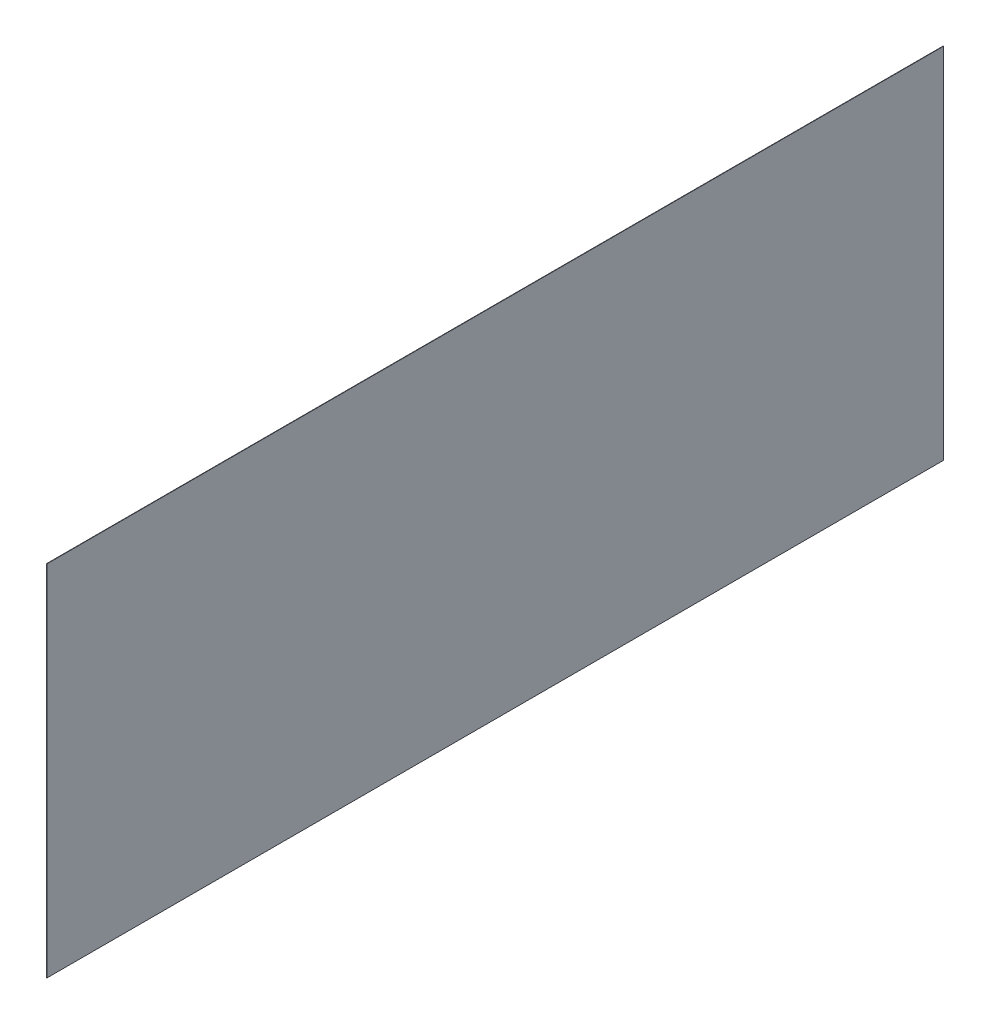
ISO-10303-21;
HEADER;
FILE_DESCRIPTION(('STEP AP214'),'2;1');
FILE_NAME('part.step','',(''),(''),'','','');
FILE_SCHEMA(('AUTOMOTIVE_DESIGN { 1 0 10303 214 1 1 1 1 }'));
ENDSEC;
DATA;
#1=APPLICATION_CONTEXT('core data for automotive mechanical design processes');
#2=APPLICATION_PROTOCOL_DEFINITION('international standard','automotive_design',2000,#1);
#3=PRODUCT_CONTEXT('',#1,'mechanical');
#4=PRODUCT('Part','Part','',(#3));
#5=PRODUCT_RELATED_PRODUCT_CATEGORY('part','',(#4));
#6=PRODUCT_DEFINITION_FORMATION('','',#4);
#7=PRODUCT_DEFINITION_CONTEXT('part definition',#1,'design');
#8=PRODUCT_DEFINITION('design','',#6,#7);
#9=PRODUCT_DEFINITION_SHAPE('','',#8);
#10=(LENGTH_UNIT() NAMED_UNIT(*) SI_UNIT(.MILLI.,.METRE.));
#11=(NAMED_UNIT(*) PLANE_ANGLE_UNIT() SI_UNIT($,.RADIAN.));
#12=(NAMED_UNIT(*) SI_UNIT($,.STERADIAN.) SOLID_ANGLE_UNIT());
#13=UNCERTAINTY_MEASURE_WITH_UNIT(LENGTH_MEASURE(1.E-05),#10,'distance_accuracy_value','');
#14=(GEOMETRIC_REPRESENTATION_CONTEXT(3) GLOBAL_UNCERTAINTY_ASSIGNED_CONTEXT((#13)) GLOBAL_UNIT_ASSIGNED_CONTEXT((#10,
#11,#12)) REPRESENTATION_CONTEXT('',''));
#15=CARTESIAN_POINT('',(0.,0.,0.));
#16=DIRECTION('',(0.,0.,1.));
#17=DIRECTION('',(1.,0.,0.));
#18=AXIS2_PLACEMENT_3D('',#15,#16,#17);
#19=CARTESIAN_POINT('',(-126.327,-60.,150.));
#20=DIRECTION('',(0.,0.,1.));
#21=DIRECTION('',(0.,-1.,0.));
#22=AXIS2_PLACEMENT_3D('',#19,#20,#21);
#23=PLANE('',#22);
#24=DIRECTION('',(0.,-1.,0.));
#25=VECTOR('',#24,1.);
#26=CARTESIAN_POINT('',(-126.2,-60.,150.));
#27=LINE('',#26,#25);
#28=CARTESIAN_POINT('',(-126.2,60.,150.));
#29=VERTEX_POINT('',#28);
#30=CARTESIAN_POINT('',(-126.2,-60.,150.));
#31=VERTEX_POINT('',#30);
#32=EDGE_CURVE('E115',#29,#31,#27,.T.);
#33=ORIENTED_EDGE('',*,*,#32,.F.);
#34=DIRECTION('',(1.,0.,0.));
#35=VECTOR('',#34,1.);
#36=CARTESIAN_POINT('',(-126.327,60.,150.));
#37=LINE('',#36,#35);
#38=CARTESIAN_POINT('',(-126.327,60.,150.));
#39=VERTEX_POINT('',#38);
#40=EDGE_CURVE('E11',#39,#29,#37,.T.);
#41=ORIENTED_EDGE('',*,*,#40,.F.);
#42=DIRECTION('',(0.,-1.,0.));
#43=VECTOR('',#42,1.);
#44=CARTESIAN_POINT('',(-126.327,-60.,150.));
#45=LINE('',#44,#43);
#46=CARTESIAN_POINT('',(-126.327,-60.,150.));
#47=VERTEX_POINT('',#46);
#48=EDGE_CURVE('E107',#39,#47,#45,.T.);
#49=ORIENTED_EDGE('',*,*,#48,.T.);
#50=DIRECTION('',(1.,0.,0.));
#51=VECTOR('',#50,1.);
#52=CARTESIAN_POINT('',(-126.327,-60.,150.));
#53=LINE('',#52,#51);
#54=EDGE_CURVE('E48',#47,#31,#53,.T.);
#55=ORIENTED_EDGE('',*,*,#54,.T.);
#56=EDGE_LOOP('',(#33,#41,#49,#55));
#57=FACE_BOUND('',#56,.T.);
#58=ADVANCED_FACE('F45',(#57),#23,.T.);
#59=CARTESIAN_POINT('',(-126.327,60.,150.));
#60=DIRECTION('',(0.,1.,0.));
#61=DIRECTION('',(0.,0.,1.));
#62=AXIS2_PLACEMENT_3D('',#59,#60,#61);
#63=PLANE('',#62);
#64=DIRECTION('',(0.,0.,1.));
#65=VECTOR('',#64,1.);
#66=CARTESIAN_POINT('',(-126.2,60.,150.));
#67=LINE('',#66,#65);
#68=CARTESIAN_POINT('',(-126.2,60.,-150.));
#69=VERTEX_POINT('',#68);
#70=EDGE_CURVE('E110',#69,#29,#67,.T.);
#71=ORIENTED_EDGE('',*,*,#70,.F.);
#72=DIRECTION('',(1.,0.,0.));
#73=VECTOR('',#72,1.);
#74=CARTESIAN_POINT('',(-126.327,60.,-150.));
#75=LINE('',#74,#73);
#76=CARTESIAN_POINT('',(-126.327,60.,-150.));
#77=VERTEX_POINT('',#76);
#78=EDGE_CURVE('E55',#77,#69,#75,.T.);
#79=ORIENTED_EDGE('',*,*,#78,.F.);
#80=DIRECTION('',(0.,0.,1.));
#81=VECTOR('',#80,1.);
#82=CARTESIAN_POINT('',(-126.327,60.,150.));
#83=LINE('',#82,#81);
#84=EDGE_CURVE('E102',#77,#39,#83,.T.);
#85=ORIENTED_EDGE('',*,*,#84,.T.);
#86=ORIENTED_EDGE('',*,*,#40,.T.);
#87=EDGE_LOOP('',(#71,#79,#85,#86));
#88=FACE_BOUND('',#87,.T.);
#89=ADVANCED_FACE('F131',(#88),#63,.T.);
#90=CARTESIAN_POINT('',(-126.327,-60.,-150.));
#91=DIRECTION('',(0.,0.,-1.));
#92=DIRECTION('',(-1.,0.,0.));
#93=AXIS2_PLACEMENT_3D('',#90,#91,#92);
#94=PLANE('',#93);
#95=DIRECTION('',(0.,1.,0.));
#96=VECTOR('',#95,1.);
#97=CARTESIAN_POINT('',(-126.2,-60.,-150.));
#98=LINE('',#97,#96);
#99=CARTESIAN_POINT('',(-126.2,-60.,-150.));
#100=VERTEX_POINT('',#99);
#101=EDGE_CURVE('E96',#100,#69,#98,.T.);
#102=ORIENTED_EDGE('',*,*,#101,.F.);
#103=DIRECTION('',(1.,0.,0.));
#104=VECTOR('',#103,1.);
#105=CARTESIAN_POINT('',(-126.327,-60.,-150.));
#106=LINE('',#105,#104);
#107=CARTESIAN_POINT('',(-126.327,-60.,-150.));
#108=VERTEX_POINT('',#107);
#109=EDGE_CURVE('E91',#108,#100,#106,.T.);
#110=ORIENTED_EDGE('',*,*,#109,.F.);
#111=DIRECTION('',(0.,1.,0.));
#112=VECTOR('',#111,1.);
#113=CARTESIAN_POINT('',(-126.327,-60.,-150.));
#114=LINE('',#113,#112);
#115=EDGE_CURVE('E94',#108,#77,#114,.T.);
#116=ORIENTED_EDGE('',*,*,#115,.T.);
#117=ORIENTED_EDGE('',*,*,#78,.T.);
#118=EDGE_LOOP('',(#102,#110,#116,#117));
#119=FACE_BOUND('',#118,.T.);
#120=ADVANCED_FACE('F93',(#119),#94,.T.);
#121=CARTESIAN_POINT('',(-126.327,-60.,150.));
#122=DIRECTION('',(0.,-1.,0.));
#123=DIRECTION('',(0.,0.,-1.));
#124=AXIS2_PLACEMENT_3D('',#121,#122,#123);
#125=PLANE('',#124);
#126=DIRECTION('',(0.,0.,-1.));
#127=VECTOR('',#126,1.);
#128=CARTESIAN_POINT('',(-126.2,-60.,150.));
#129=LINE('',#128,#127);
#130=EDGE_CURVE('E119',#31,#100,#129,.T.);
#131=ORIENTED_EDGE('',*,*,#130,.F.);
#132=ORIENTED_EDGE('',*,*,#54,.F.);
#133=DIRECTION('',(0.,0.,-1.));
#134=VECTOR('',#133,1.);
#135=CARTESIAN_POINT('',(-126.327,-60.,150.));
#136=LINE('',#135,#134);
#137=EDGE_CURVE('E101',#47,#108,#136,.T.);
#138=ORIENTED_EDGE('',*,*,#137,.T.);
#139=ORIENTED_EDGE('',*,*,#109,.T.);
#140=EDGE_LOOP('',(#131,#132,#138,#139));
#141=FACE_BOUND('',#140,.T.);
#142=ADVANCED_FACE('F105',(#141),#125,.T.);
#143=CARTESIAN_POINT('',(-126.327,0.,0.));
#144=DIRECTION('',(-1.,0.,0.));
#145=DIRECTION('',(0.,0.,1.));
#146=AXIS2_PLACEMENT_3D('',#143,#144,#145);
#147=PLANE('',#146);
#148=ORIENTED_EDGE('',*,*,#48,.F.);
#149=ORIENTED_EDGE('',*,*,#84,.F.);
#150=ORIENTED_EDGE('',*,*,#115,.F.);
#151=ORIENTED_EDGE('',*,*,#137,.F.);
#152=EDGE_LOOP('',(#148,#149,#150,#151));
#153=FACE_BOUND('',#152,.T.);
#154=ADVANCED_FACE('F100',(#153),#147,.T.);
#155=CARTESIAN_POINT('',(-126.2,0.,0.));
#156=DIRECTION('',(-1.,0.,0.));
#157=DIRECTION('',(0.,0.,1.));
#158=AXIS2_PLACEMENT_3D('',#155,#156,#157);
#159=PLANE('',#158);
#160=ORIENTED_EDGE('',*,*,#32,.T.);
#161=ORIENTED_EDGE('',*,*,#130,.T.);
#162=ORIENTED_EDGE('',*,*,#101,.T.);
#163=ORIENTED_EDGE('',*,*,#70,.T.);
#164=EDGE_LOOP('',(#160,#161,#162,#163));
#165=FACE_BOUND('',#164,.T.);
#166=ADVANCED_FACE('F130',(#165),#159,.F.);
#167=CLOSED_SHELL('',(#58,#89,#120,#142,#154,#166));
#168=MANIFOLD_SOLID_BREP('B2',#167);
#169=ADVANCED_BREP_SHAPE_REPRESENTATION('',(#18,#168),#14);
#170=SHAPE_DEFINITION_REPRESENTATION(#9,#169);
ENDSEC;
END-ISO-10303-21;
